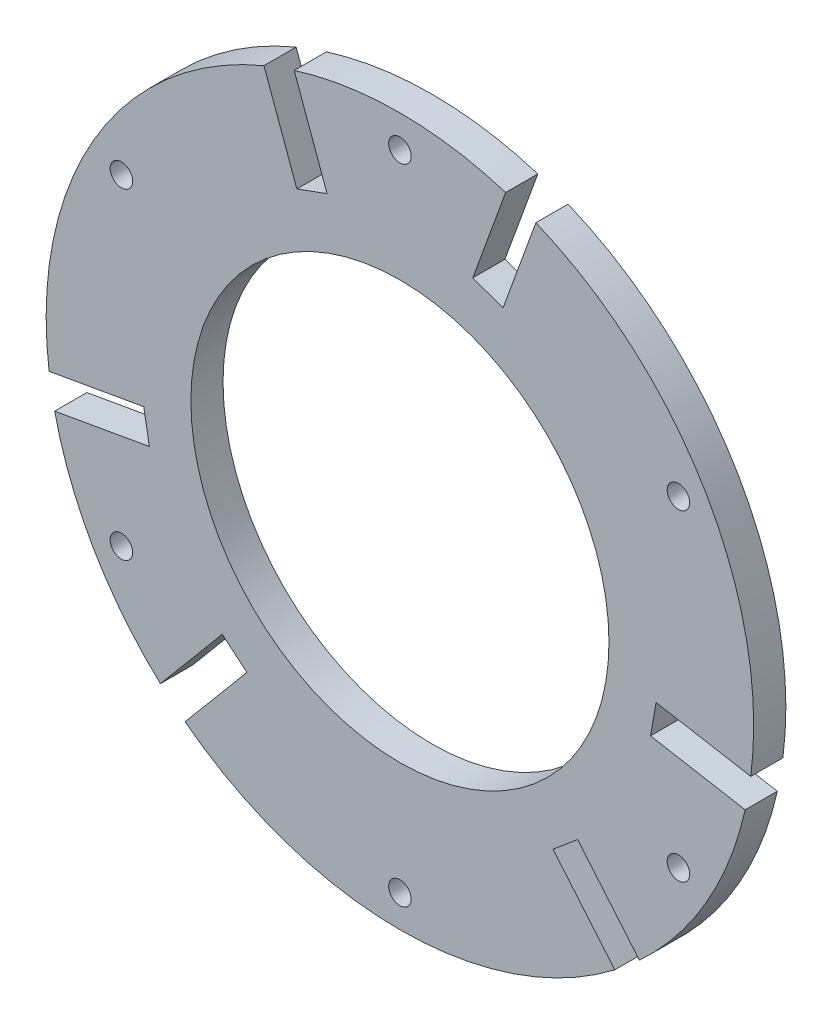
ISO-10303-21;
HEADER;
FILE_DESCRIPTION(('STEP AP214'),'2;1');
FILE_NAME('part.step','',(''),(''),'','','');
FILE_SCHEMA(('AUTOMOTIVE_DESIGN { 1 0 10303 214 1 1 1 1 }'));
ENDSEC;
DATA;
#1=APPLICATION_CONTEXT('core data for automotive mechanical design processes');
#2=APPLICATION_PROTOCOL_DEFINITION('international standard','automotive_design',2000,#1);
#3=PRODUCT_CONTEXT('',#1,'mechanical');
#4=PRODUCT('Part','Part','',(#3));
#5=PRODUCT_RELATED_PRODUCT_CATEGORY('part','',(#4));
#6=PRODUCT_DEFINITION_FORMATION('','',#4);
#7=PRODUCT_DEFINITION_CONTEXT('part definition',#1,'design');
#8=PRODUCT_DEFINITION('design','',#6,#7);
#9=PRODUCT_DEFINITION_SHAPE('','',#8);
#10=(LENGTH_UNIT() NAMED_UNIT(*) SI_UNIT(.MILLI.,.METRE.));
#11=(NAMED_UNIT(*) PLANE_ANGLE_UNIT() SI_UNIT($,.RADIAN.));
#12=(NAMED_UNIT(*) SI_UNIT($,.STERADIAN.) SOLID_ANGLE_UNIT());
#13=UNCERTAINTY_MEASURE_WITH_UNIT(LENGTH_MEASURE(1.E-05),#10,'distance_accuracy_value','');
#14=(GEOMETRIC_REPRESENTATION_CONTEXT(3) GLOBAL_UNCERTAINTY_ASSIGNED_CONTEXT((#13)) GLOBAL_UNIT_ASSIGNED_CONTEXT((#10,
#11,#12)) REPRESENTATION_CONTEXT('',''));
#15=CARTESIAN_POINT('',(0.,0.,0.));
#16=DIRECTION('',(0.,0.,1.));
#17=DIRECTION('',(1.,0.,0.));
#18=AXIS2_PLACEMENT_3D('',#15,#16,#17);
#19=CARTESIAN_POINT('',(0.,0.,5.));
#20=DIRECTION('',(0.,0.,-1.));
#21=DIRECTION('',(-1.,0.,0.));
#22=AXIS2_PLACEMENT_3D('',#19,#20,#21);
#23=CYLINDRICAL_SURFACE('',#22,55.);
#24=CARTESIAN_POINT('',(0.,0.,5.));
#25=DIRECTION('',(0.,0.,1.));
#26=DIRECTION('',(1.,0.,0.));
#27=AXIS2_PLACEMENT_3D('',#24,#25,#26);
#28=CIRCLE('',#27,55.);
#29=CARTESIAN_POINT('',(-53.6739247990592,-12.004573989315,5.));
#30=VERTEX_POINT('',#29);
#31=CARTESIAN_POINT('',(-37.2332284358741,-40.4806954021545,5.));
#32=VERTEX_POINT('',#31);
#33=EDGE_CURVE('E368',#30,#32,#28,.T.);
#34=ORIENTED_EDGE('',*,*,#33,.F.);
#35=DIRECTION('',(0.,0.,-1.));
#36=VECTOR('',#35,1.);
#37=CARTESIAN_POINT('',(-53.6739247990592,-12.004573989315,5.));
#38=LINE('',#37,#36);
#39=CARTESIAN_POINT('',(-53.6739247990592,-12.004573989315,0.));
#40=VERTEX_POINT('',#39);
#41=EDGE_CURVE('E226',#30,#40,#38,.T.);
#42=ORIENTED_EDGE('',*,*,#41,.T.);
#43=CARTESIAN_POINT('',(0.,0.,0.));
#44=DIRECTION('',(0.,0.,1.));
#45=DIRECTION('',(1.,0.,0.));
#46=AXIS2_PLACEMENT_3D('',#43,#44,#45);
#47=CIRCLE('',#46,55.);
#48=CARTESIAN_POINT('',(-37.2332284358741,-40.4806954021545,0.));
#49=VERTEX_POINT('',#48);
#50=EDGE_CURVE('E372',#40,#49,#47,.T.);
#51=ORIENTED_EDGE('',*,*,#50,.T.);
#52=DIRECTION('',(0.,0.,-1.));
#53=VECTOR('',#52,1.);
#54=CARTESIAN_POINT('',(-37.2332284358741,-40.4806954021545,5.));
#55=LINE('',#54,#53);
#56=EDGE_CURVE('E248',#49,#32,#55,.F.);
#57=ORIENTED_EDGE('',*,*,#56,.T.);
#58=EDGE_LOOP('',(#34,#42,#51,#57));
#59=FACE_BOUND('',#58,.T.);
#60=ADVANCED_FACE('F32',(#59),#23,.T.);
#61=CARTESIAN_POINT('',(-21.1392160617393,50.7753241673069,0.));
#62=VERTEX_POINT('',#61);
#63=CARTESIAN_POINT('',(-54.542328645147,-7.0805639581026,0.));
#64=VERTEX_POINT('',#63);
#65=EDGE_CURVE('E370',#62,#64,#47,.T.);
#66=ORIENTED_EDGE('',*,*,#65,.T.);
#67=DIRECTION('',(0.,0.,-1.));
#68=VECTOR('',#67,1.);
#69=CARTESIAN_POINT('',(-54.542328645147,-7.0805639581026,5.));
#70=LINE('',#69,#68);
#71=CARTESIAN_POINT('',(-54.542328645147,-7.0805639581026,5.));
#72=VERTEX_POINT('',#71);
#73=EDGE_CURVE('E47',#64,#72,#70,.F.);
#74=ORIENTED_EDGE('',*,*,#73,.T.);
#75=CARTESIAN_POINT('',(-21.1392160617393,50.7753241673069,5.));
#76=VERTEX_POINT('',#75);
#77=EDGE_CURVE('E364',#76,#72,#28,.T.);
#78=ORIENTED_EDGE('',*,*,#77,.F.);
#79=DIRECTION('',(0.,0.,-1.));
#80=VECTOR('',#79,1.);
#81=CARTESIAN_POINT('',(-21.1392160617393,50.7753241673069,5.));
#82=LINE('',#81,#80);
#83=EDGE_CURVE('E355',#76,#62,#82,.T.);
#84=ORIENTED_EDGE('',*,*,#83,.T.);
#85=EDGE_LOOP('',(#66,#74,#78,#84));
#86=FACE_BOUND('',#85,.T.);
#87=ADVANCED_FACE('F447',(#86),#23,.T.);
#88=CARTESIAN_POINT('',(37.2332284358955,-40.4806954021348,5.));
#89=VERTEX_POINT('',#88);
#90=CARTESIAN_POINT('',(53.6739247990633,-12.0045739892965,5.));
#91=VERTEX_POINT('',#90);
#92=EDGE_CURVE('E396',#89,#91,#28,.T.);
#93=ORIENTED_EDGE('',*,*,#92,.F.);
#94=DIRECTION('',(0.,0.,-1.));
#95=VECTOR('',#94,1.);
#96=CARTESIAN_POINT('',(37.2332284358955,-40.4806954021348,5.));
#97=LINE('',#96,#95);
#98=CARTESIAN_POINT('',(37.2332284358955,-40.4806954021348,0.));
#99=VERTEX_POINT('',#98);
#100=EDGE_CURVE('E273',#89,#99,#97,.T.);
#101=ORIENTED_EDGE('',*,*,#100,.T.);
#102=CARTESIAN_POINT('',(53.6739247990633,-12.0045739892965,0.));
#103=VERTEX_POINT('',#102);
#104=EDGE_CURVE('E419',#99,#103,#47,.T.);
#105=ORIENTED_EDGE('',*,*,#104,.T.);
#106=DIRECTION('',(0.,0.,-1.));
#107=VECTOR('',#106,1.);
#108=CARTESIAN_POINT('',(53.6739247990633,-12.0045739892965,5.));
#109=LINE('',#108,#107);
#110=EDGE_CURVE('E304',#103,#91,#109,.F.);
#111=ORIENTED_EDGE('',*,*,#110,.T.);
#112=EDGE_LOOP('',(#93,#101,#105,#111));
#113=FACE_BOUND('',#112,.T.);
#114=ADVANCED_FACE('F451',(#113),#23,.T.);
#115=CARTESIAN_POINT('',(-33.4031125833977,-43.6947602092157,5.));
#116=VERTEX_POINT('',#115);
#117=CARTESIAN_POINT('',(33.4031125834208,-43.6947602091981,5.));
#118=VERTEX_POINT('',#117);
#119=EDGE_CURVE('E393',#116,#118,#28,.T.);
#120=ORIENTED_EDGE('',*,*,#119,.F.);
#121=DIRECTION('',(0.,0.,-1.));
#122=VECTOR('',#121,1.);
#123=CARTESIAN_POINT('',(-33.4031125833976,-43.6947602092157,5.));
#124=LINE('',#123,#122);
#125=CARTESIAN_POINT('',(-33.4031125833977,-43.6947602092157,0.));
#126=VERTEX_POINT('',#125);
#127=EDGE_CURVE('E244',#116,#126,#124,.T.);
#128=ORIENTED_EDGE('',*,*,#127,.T.);
#129=CARTESIAN_POINT('',(33.4031125834208,-43.6947602091981,0.));
#130=VERTEX_POINT('',#129);
#131=EDGE_CURVE('E385',#126,#130,#47,.T.);
#132=ORIENTED_EDGE('',*,*,#131,.T.);
#133=DIRECTION('',(0.,0.,-1.));
#134=VECTOR('',#133,1.);
#135=CARTESIAN_POINT('',(33.4031125834208,-43.6947602091981,5.));
#136=LINE('',#135,#134);
#137=EDGE_CURVE('E269',#130,#118,#136,.F.);
#138=ORIENTED_EDGE('',*,*,#137,.T.);
#139=EDGE_LOOP('',(#120,#128,#132,#138));
#140=FACE_BOUND('',#139,.T.);
#141=ADVANCED_FACE('F391',(#140),#23,.T.);
#142=CARTESIAN_POINT('',(54.5423286451494,-7.08056395808375,5.));
#143=VERTEX_POINT('',#142);
#144=CARTESIAN_POINT('',(21.1392160617393,50.7753241673069,5.));
#145=VERTEX_POINT('',#144);
#146=EDGE_CURVE('E397',#143,#145,#28,.T.);
#147=ORIENTED_EDGE('',*,*,#146,.F.);
#148=DIRECTION('',(0.,0.,-1.));
#149=VECTOR('',#148,1.);
#150=CARTESIAN_POINT('',(54.5423286451494,-7.08056395808375,5.));
#151=LINE('',#150,#149);
#152=CARTESIAN_POINT('',(54.5423286451494,-7.08056395808375,0.));
#153=VERTEX_POINT('',#152);
#154=EDGE_CURVE('E299',#143,#153,#151,.T.);
#155=ORIENTED_EDGE('',*,*,#154,.T.);
#156=CARTESIAN_POINT('',(21.1392160617393,50.7753241673069,0.));
#157=VERTEX_POINT('',#156);
#158=EDGE_CURVE('E418',#153,#157,#47,.T.);
#159=ORIENTED_EDGE('',*,*,#158,.T.);
#160=DIRECTION('',(0.,0.,-1.));
#161=VECTOR('',#160,1.);
#162=CARTESIAN_POINT('',(21.1392160617393,50.7753241673069,5.));
#163=LINE('',#162,#161);
#164=EDGE_CURVE('E335',#157,#145,#163,.F.);
#165=ORIENTED_EDGE('',*,*,#164,.T.);
#166=EDGE_LOOP('',(#147,#155,#159,#165));
#167=FACE_BOUND('',#166,.T.);
#168=ADVANCED_FACE('F454',(#167),#23,.T.);
#169=CARTESIAN_POINT('',(16.4406963631761,52.4852693914573,5.));
#170=VERTEX_POINT('',#169);
#171=CARTESIAN_POINT('',(-16.4406963631761,52.4852693914573,5.));
#172=VERTEX_POINT('',#171);
#173=EDGE_CURVE('E369',#170,#172,#28,.T.);
#174=ORIENTED_EDGE('',*,*,#173,.F.);
#175=DIRECTION('',(0.,0.,-1.));
#176=VECTOR('',#175,1.);
#177=CARTESIAN_POINT('',(16.4406963631761,52.4852693914573,5.));
#178=LINE('',#177,#176);
#179=CARTESIAN_POINT('',(16.4406963631761,52.4852693914573,0.));
#180=VERTEX_POINT('',#179);
#181=EDGE_CURVE('E330',#170,#180,#178,.T.);
#182=ORIENTED_EDGE('',*,*,#181,.T.);
#183=CARTESIAN_POINT('',(-16.4406963631761,52.4852693914573,0.));
#184=VERTEX_POINT('',#183);
#185=EDGE_CURVE('E363',#180,#184,#47,.T.);
#186=ORIENTED_EDGE('',*,*,#185,.T.);
#187=DIRECTION('',(0.,0.,-1.));
#188=VECTOR('',#187,1.);
#189=CARTESIAN_POINT('',(-16.4406963631761,52.4852693914573,5.));
#190=LINE('',#189,#188);
#191=EDGE_CURVE('E360',#184,#172,#190,.F.);
#192=ORIENTED_EDGE('',*,*,#191,.T.);
#193=EDGE_LOOP('',(#174,#182,#186,#192));
#194=FACE_BOUND('',#193,.T.);
#195=ADVANCED_FACE('F34',(#194),#23,.T.);
#196=CARTESIAN_POINT('',(0.,0.,5.));
#197=DIRECTION('',(0.,0.,1.));
#198=DIRECTION('',(1.,0.,0.));
#199=AXIS2_PLACEMENT_3D('',#196,#197,#198);
#200=PLANE('',#199);
#201=CARTESIAN_POINT('',(-43.3012701892209,24.9999999999981,5.));
#202=DIRECTION('',(0.,0.,1.));
#203=DIRECTION('',(1.,0.,0.));
#204=AXIS2_PLACEMENT_3D('',#201,#202,#203);
#205=CIRCLE('',#204,1.75);
#206=CARTESIAN_POINT('',(-41.5512701892209,24.9999999999981,5.));
#207=VERTEX_POINT('',#206);
#208=EDGE_CURVE('E589',#207,#207,#205,.T.);
#209=ORIENTED_EDGE('',*,*,#208,.F.);
#210=EDGE_LOOP('',(#209));
#211=FACE_BOUND('',#210,.T.);
#212=CARTESIAN_POINT('',(-43.3012701892187,-25.0000000000019,5.));
#213=DIRECTION('',(0.,0.,1.));
#214=DIRECTION('',(1.,0.,0.));
#215=AXIS2_PLACEMENT_3D('',#212,#213,#214);
#216=CIRCLE('',#215,1.75);
#217=CARTESIAN_POINT('',(-41.5512701892187,-25.0000000000019,5.));
#218=VERTEX_POINT('',#217);
#219=EDGE_CURVE('E591',#218,#218,#216,.T.);
#220=ORIENTED_EDGE('',*,*,#219,.F.);
#221=EDGE_LOOP('',(#220));
#222=FACE_BOUND('',#221,.T.);
#223=CARTESIAN_POINT('',(4.251010553249E-12,-50.,5.));
#224=DIRECTION('',(0.,0.,1.));
#225=DIRECTION('',(1.,0.,0.));
#226=AXIS2_PLACEMENT_3D('',#223,#224,#225);
#227=CIRCLE('',#226,1.75);
#228=CARTESIAN_POINT('',(1.75000000000425,-50.,5.));
#229=VERTEX_POINT('',#228);
#230=EDGE_CURVE('E595',#229,#229,#227,.T.);
#231=ORIENTED_EDGE('',*,*,#230,.F.);
#232=EDGE_LOOP('',(#231));
#233=FACE_BOUND('',#232,.T.);
#234=CARTESIAN_POINT('',(43.3012701892251,-24.9999999999982,5.));
#235=DIRECTION('',(0.,0.,1.));
#236=DIRECTION('',(1.,0.,0.));
#237=AXIS2_PLACEMENT_3D('',#234,#235,#236);
#238=CIRCLE('',#237,1.75);
#239=CARTESIAN_POINT('',(45.0512701892251,-24.9999999999982,5.));
#240=VERTEX_POINT('',#239);
#241=EDGE_CURVE('E599',#240,#240,#238,.T.);
#242=ORIENTED_EDGE('',*,*,#241,.F.);
#243=EDGE_LOOP('',(#242));
#244=FACE_BOUND('',#243,.T.);
#245=CARTESIAN_POINT('',(43.301270189223,25.0000000000018,5.));
#246=DIRECTION('',(0.,0.,1.));
#247=DIRECTION('',(1.,0.,0.));
#248=AXIS2_PLACEMENT_3D('',#245,#246,#247);
#249=CIRCLE('',#248,1.75);
#250=CARTESIAN_POINT('',(45.051270189223,25.0000000000018,5.));
#251=VERTEX_POINT('',#250);
#252=EDGE_CURVE('E218',#251,#251,#249,.T.);
#253=ORIENTED_EDGE('',*,*,#252,.F.);
#254=EDGE_LOOP('',(#253));
#255=FACE_BOUND('',#254,.T.);
#256=DIRECTION('',(0.984807753012207,0.173648177666937,0.));
#257=VECTOR('',#256,1.);
#258=CARTESIAN_POINT('',(-38.9578739306604,-9.40973717173799,5.));
#259=LINE('',#258,#257);
#260=CARTESIAN_POINT('',(-38.9578739306604,-9.40973717173799,5.));
#261=VERTEX_POINT('',#260);
#262=EDGE_CURVE('E213',#30,#261,#259,.T.);
#263=ORIENTED_EDGE('',*,*,#262,.F.);
#264=ORIENTED_EDGE('',*,*,#33,.T.);
#265=DIRECTION('',(-0.642787609686544,-0.766044443118974,0.));
#266=VECTOR('',#265,1.);
#267=CARTESIAN_POINT('',(-27.6280083989812,-29.0336399155296,5.));
#268=LINE('',#267,#266);
#269=CARTESIAN_POINT('',(-27.6280083989812,-29.0336399155296,5.));
#270=VERTEX_POINT('',#269);
#271=EDGE_CURVE('E232',#270,#32,#268,.T.);
#272=ORIENTED_EDGE('',*,*,#271,.F.);
#273=DIRECTION('',(-0.766044443118974,0.642787609686544,0.));
#274=VECTOR('',#273,1.);
#275=CARTESIAN_POINT('',(-23.7977861833863,-32.2475779639624,5.));
#276=LINE('',#275,#274);
#277=CARTESIAN_POINT('',(-23.7977861833863,-32.2475779639624,5.));
#278=VERTEX_POINT('',#277);
#279=EDGE_CURVE('E237',#278,#270,#276,.T.);
#280=ORIENTED_EDGE('',*,*,#279,.F.);
#281=DIRECTION('',(0.642787609686544,0.766044443118974,0.));
#282=VECTOR('',#281,1.);
#283=CARTESIAN_POINT('',(-33.4396003286845,-43.738244610747,5.));
#284=LINE('',#283,#282);
#285=EDGE_CURVE('E229',#116,#278,#284,.T.);
#286=ORIENTED_EDGE('',*,*,#285,.F.);
#287=ORIENTED_EDGE('',*,*,#119,.T.);
#288=DIRECTION('',(0.642787609686545,-0.766044443118973,0.));
#289=VECTOR('',#288,1.);
#290=CARTESIAN_POINT('',(33.43960032871,-43.7382446107322,5.));
#291=LINE('',#290,#289);
#292=CARTESIAN_POINT('',(23.7977861834119,-32.2475779639476,5.));
#293=VERTEX_POINT('',#292);
#294=EDGE_CURVE('E262',#293,#118,#291,.T.);
#295=ORIENTED_EDGE('',*,*,#294,.F.);
#296=DIRECTION('',(-0.766044443118973,-0.642787609686545,0.));
#297=VECTOR('',#296,1.);
#298=CARTESIAN_POINT('',(23.7977861834119,-32.2475779639476,5.));
#299=LINE('',#298,#297);
#300=CARTESIAN_POINT('',(27.6280083990068,-29.0336399155149,5.));
#301=VERTEX_POINT('',#300);
#302=EDGE_CURVE('E251',#301,#293,#299,.T.);
#303=ORIENTED_EDGE('',*,*,#302,.F.);
#304=DIRECTION('',(-0.642787609686544,0.766044443118974,0.));
#305=VECTOR('',#304,1.);
#306=CARTESIAN_POINT('',(27.6280083990068,-29.0336399155149,5.));
#307=LINE('',#306,#305);
#308=EDGE_CURVE('E256',#89,#301,#307,.T.);
#309=ORIENTED_EDGE('',*,*,#308,.F.);
#310=ORIENTED_EDGE('',*,*,#92,.T.);
#311=DIRECTION('',(0.984807753012207,-0.173648177666936,0.));
#312=VECTOR('',#311,1.);
#313=CARTESIAN_POINT('',(38.9578739306859,-9.40973717172323,5.));
#314=LINE('',#313,#312);
#315=CARTESIAN_POINT('',(38.9578739306859,-9.40973717172323,5.));
#316=VERTEX_POINT('',#315);
#317=EDGE_CURVE('E287',#316,#91,#314,.T.);
#318=ORIENTED_EDGE('',*,*,#317,.F.);
#319=DIRECTION('',(-0.173648177666935,-0.984807753012207,0.));
#320=VECTOR('',#319,1.);
#321=CARTESIAN_POINT('',(39.8261148190206,-4.48569840666219,5.));
#322=LINE('',#321,#320);
#323=CARTESIAN_POINT('',(39.8261148190206,-4.48569840666219,5.));
#324=VERTEX_POINT('',#323);
#325=EDGE_CURVE('E292',#324,#316,#322,.T.);
#326=ORIENTED_EDGE('',*,*,#325,.F.);
#327=DIRECTION('',(-0.984807753012207,0.173648177666937,0.));
#328=VECTOR('',#327,1.);
#329=CARTESIAN_POINT('',(54.5982311142037,-7.09042107166623,5.));
#330=LINE('',#329,#328);
#331=EDGE_CURVE('E280',#143,#324,#330,.T.);
#332=ORIENTED_EDGE('',*,*,#331,.F.);
#333=ORIENTED_EDGE('',*,*,#146,.T.);
#334=DIRECTION('',(0.342020143325662,0.939692620785911,0.));
#335=VECTOR('',#334,1.);
#336=CARTESIAN_POINT('',(21.1586307854936,50.828665682427,5.));
#337=LINE('',#336,#335);
#338=CARTESIAN_POINT('',(16.0283286356087,36.7332763706383,5.));
#339=VERTEX_POINT('',#338);
#340=EDGE_CURVE('E311',#339,#145,#337,.T.);
#341=ORIENTED_EDGE('',*,*,#340,.F.);
#342=DIRECTION('',(0.939692620785911,-0.342020143325661,0.));
#343=VECTOR('',#342,1.);
#344=CARTESIAN_POINT('',(16.0283286356087,36.7332763706383,5.));
#345=LINE('',#344,#343);
#346=CARTESIAN_POINT('',(11.3298655316792,38.4433770872666,5.));
#347=VERTEX_POINT('',#346);
#348=EDGE_CURVE('E318',#347,#339,#345,.T.);
#349=ORIENTED_EDGE('',*,*,#348,.F.);
#350=DIRECTION('',(-0.342020143325663,-0.939692620785911,0.));
#351=VECTOR('',#350,1.);
#352=CARTESIAN_POINT('',(11.3298655316792,38.4433770872666,5.));
#353=LINE('',#352,#351);
#354=EDGE_CURVE('E324',#170,#347,#353,.T.);
#355=ORIENTED_EDGE('',*,*,#354,.F.);
#356=ORIENTED_EDGE('',*,*,#173,.T.);
#357=DIRECTION('',(-0.342020143325663,0.939692620785911,0.));
#358=VECTOR('',#357,1.);
#359=CARTESIAN_POINT('',(-11.3298655316791,38.4433770872666,5.));
#360=LINE('',#359,#358);
#361=CARTESIAN_POINT('',(-11.3298655316791,38.4433770872666,5.));
#362=VERTEX_POINT('',#361);
#363=EDGE_CURVE('E343',#362,#172,#360,.T.);
#364=ORIENTED_EDGE('',*,*,#363,.F.);
#365=DIRECTION('',(0.93969262078591,0.342020143325663,0.));
#366=VECTOR('',#365,1.);
#367=CARTESIAN_POINT('',(-16.0283286356087,36.7332763706383,5.));
#368=LINE('',#367,#366);
#369=CARTESIAN_POINT('',(-16.0283286356087,36.7332763706383,5.));
#370=VERTEX_POINT('',#369);
#371=EDGE_CURVE('E348',#370,#362,#368,.T.);
#372=ORIENTED_EDGE('',*,*,#371,.F.);
#373=DIRECTION('',(0.342020143325663,-0.939692620785911,0.));
#374=VECTOR('',#373,1.);
#375=CARTESIAN_POINT('',(-21.1586307854936,50.828665682427,5.));
#376=LINE('',#375,#374);
#377=EDGE_CURVE('E338',#76,#370,#376,.T.);
#378=ORIENTED_EDGE('',*,*,#377,.F.);
#379=ORIENTED_EDGE('',*,*,#77,.T.);
#380=DIRECTION('',(-0.984807753012207,-0.173648177666938,0.));
#381=VECTOR('',#380,1.);
#382=CARTESIAN_POINT('',(-54.5982311141781,-7.09042107168101,5.));
#383=LINE('',#382,#381);
#384=CARTESIAN_POINT('',(-39.8261148189951,-4.48569840667695,5.));
#385=VERTEX_POINT('',#384);
#386=EDGE_CURVE('E215',#385,#72,#383,.T.);
#387=ORIENTED_EDGE('',*,*,#386,.F.);
#388=DIRECTION('',(-0.173648177666938,0.984807753012207,0.));
#389=VECTOR('',#388,1.);
#390=CARTESIAN_POINT('',(-39.8261148189951,-4.48569840667695,5.));
#391=LINE('',#390,#389);
#392=EDGE_CURVE('E201',#261,#385,#391,.T.);
#393=ORIENTED_EDGE('',*,*,#392,.F.);
#394=EDGE_LOOP('',(#263,#264,#272,#280,#286,#287,#295,#303,#309,#310,#318,#326,#332,#333,#341,
#349,#355,#356,#364,#372,#378,#379,#387,#393));
#395=FACE_BOUND('',#394,.T.);
#396=CARTESIAN_POINT('',(0.00159899207128547,0.000923178502788741,5.));
#397=DIRECTION('',(0.,0.,1.));
#398=DIRECTION('',(1.,0.,0.));
#399=AXIS2_PLACEMENT_3D('',#396,#397,#398);
#400=CIRCLE('',#399,32.5);
#401=CARTESIAN_POINT('',(32.5015989920713,0.000923178502788741,5.));
#402=VERTEX_POINT('',#401);
#403=EDGE_CURVE('E276',#402,#402,#400,.T.);
#404=ORIENTED_EDGE('',*,*,#403,.F.);
#405=EDGE_LOOP('',(#404));
#406=FACE_BOUND('',#405,.T.);
#407=CARTESIAN_POINT('',(0.,50.,5.));
#408=DIRECTION('',(0.,0.,1.));
#409=DIRECTION('',(1.,0.,0.));
#410=AXIS2_PLACEMENT_3D('',#407,#408,#409);
#411=CIRCLE('',#410,1.75);
#412=CARTESIAN_POINT('',(1.75,50.,5.));
#413=VERTEX_POINT('',#412);
#414=EDGE_CURVE('E307',#413,#413,#411,.T.);
#415=ORIENTED_EDGE('',*,*,#414,.F.);
#416=EDGE_LOOP('',(#415));
#417=FACE_BOUND('',#416,.T.);
#418=ADVANCED_FACE('F408',(#211,#222,#233,#244,#255,#395,#406,#417),#200,.T.);
#419=CARTESIAN_POINT('',(0.,0.,0.));
#420=DIRECTION('',(0.,0.,1.));
#421=DIRECTION('',(1.,0.,0.));
#422=AXIS2_PLACEMENT_3D('',#419,#420,#421);
#423=PLANE('',#422);
#424=CARTESIAN_POINT('',(-43.3012701892209,24.9999999999981,0.));
#425=DIRECTION('',(0.,0.,1.));
#426=DIRECTION('',(1.,0.,0.));
#427=AXIS2_PLACEMENT_3D('',#424,#425,#426);
#428=CIRCLE('',#427,1.75);
#429=CARTESIAN_POINT('',(-41.5512701892209,24.9999999999981,0.));
#430=VERTEX_POINT('',#429);
#431=EDGE_CURVE('E500',#430,#430,#428,.T.);
#432=ORIENTED_EDGE('',*,*,#431,.T.);
#433=EDGE_LOOP('',(#432));
#434=FACE_BOUND('',#433,.T.);
#435=CARTESIAN_POINT('',(-43.3012701892187,-25.0000000000019,0.));
#436=DIRECTION('',(0.,0.,1.));
#437=DIRECTION('',(1.,0.,0.));
#438=AXIS2_PLACEMENT_3D('',#435,#436,#437);
#439=CIRCLE('',#438,1.75);
#440=CARTESIAN_POINT('',(-41.5512701892187,-25.0000000000019,0.));
#441=VERTEX_POINT('',#440);
#442=EDGE_CURVE('E504',#441,#441,#439,.T.);
#443=ORIENTED_EDGE('',*,*,#442,.T.);
#444=EDGE_LOOP('',(#443));
#445=FACE_BOUND('',#444,.T.);
#446=CARTESIAN_POINT('',(4.251010553249E-12,-50.,0.));
#447=DIRECTION('',(0.,0.,1.));
#448=DIRECTION('',(1.,0.,0.));
#449=AXIS2_PLACEMENT_3D('',#446,#447,#448);
#450=CIRCLE('',#449,1.75);
#451=CARTESIAN_POINT('',(1.75000000000425,-50.,0.));
#452=VERTEX_POINT('',#451);
#453=EDGE_CURVE('E508',#452,#452,#450,.T.);
#454=ORIENTED_EDGE('',*,*,#453,.T.);
#455=EDGE_LOOP('',(#454));
#456=FACE_BOUND('',#455,.T.);
#457=CARTESIAN_POINT('',(43.3012701892251,-24.9999999999982,0.));
#458=DIRECTION('',(0.,0.,1.));
#459=DIRECTION('',(1.,0.,0.));
#460=AXIS2_PLACEMENT_3D('',#457,#458,#459);
#461=CIRCLE('',#460,1.75);
#462=CARTESIAN_POINT('',(45.0512701892251,-24.9999999999982,0.));
#463=VERTEX_POINT('',#462);
#464=EDGE_CURVE('E512',#463,#463,#461,.T.);
#465=ORIENTED_EDGE('',*,*,#464,.T.);
#466=EDGE_LOOP('',(#465));
#467=FACE_BOUND('',#466,.T.);
#468=CARTESIAN_POINT('',(43.301270189223,25.0000000000018,0.));
#469=DIRECTION('',(0.,0.,1.));
#470=DIRECTION('',(1.,0.,0.));
#471=AXIS2_PLACEMENT_3D('',#468,#469,#470);
#472=CIRCLE('',#471,1.75);
#473=CARTESIAN_POINT('',(45.051270189223,25.0000000000018,0.));
#474=VERTEX_POINT('',#473);
#475=EDGE_CURVE('E222',#474,#474,#472,.T.);
#476=ORIENTED_EDGE('',*,*,#475,.T.);
#477=EDGE_LOOP('',(#476));
#478=FACE_BOUND('',#477,.T.);
#479=CARTESIAN_POINT('',(0.00159899207128547,0.000923178502788741,0.));
#480=DIRECTION('',(0.,0.,1.));
#481=DIRECTION('',(1.,0.,0.));
#482=AXIS2_PLACEMENT_3D('',#479,#480,#481);
#483=CIRCLE('',#482,32.5);
#484=CARTESIAN_POINT('',(32.5015989920713,0.000923178502788741,0.));
#485=VERTEX_POINT('',#484);
#486=EDGE_CURVE('E277',#485,#485,#483,.T.);
#487=ORIENTED_EDGE('',*,*,#486,.T.);
#488=EDGE_LOOP('',(#487));
#489=FACE_BOUND('',#488,.T.);
#490=CARTESIAN_POINT('',(0.,50.,0.));
#491=DIRECTION('',(0.,0.,1.));
#492=DIRECTION('',(1.,0.,0.));
#493=AXIS2_PLACEMENT_3D('',#490,#491,#492);
#494=CIRCLE('',#493,1.75);
#495=CARTESIAN_POINT('',(1.75,50.,0.));
#496=VERTEX_POINT('',#495);
#497=EDGE_CURVE('E308',#496,#496,#494,.T.);
#498=ORIENTED_EDGE('',*,*,#497,.T.);
#499=EDGE_LOOP('',(#498));
#500=FACE_BOUND('',#499,.T.);
#501=ORIENTED_EDGE('',*,*,#50,.F.);
#502=DIRECTION('',(0.984807753012207,0.173648177666937,0.));
#503=VECTOR('',#502,1.);
#504=CARTESIAN_POINT('',(0.434436189811763,-2.46381006506334,0.));
#505=LINE('',#504,#503);
#506=CARTESIAN_POINT('',(-38.9578739306604,-9.40973717173799,0.));
#507=VERTEX_POINT('',#506);
#508=EDGE_CURVE('E11',#40,#507,#505,.T.);
#509=ORIENTED_EDGE('',*,*,#508,.T.);
#510=DIRECTION('',(-0.173648177666938,0.984807753012207,0.));
#511=VECTOR('',#510,1.);
#512=CARTESIAN_POINT('',(-39.8261148189951,-4.48569840667695,0.));
#513=LINE('',#512,#511);
#514=CARTESIAN_POINT('',(-39.8261148189951,-4.48569840667695,0.));
#515=VERTEX_POINT('',#514);
#516=EDGE_CURVE('E199',#507,#515,#513,.T.);
#517=ORIENTED_EDGE('',*,*,#516,.T.);
#518=DIRECTION('',(-0.984807753012207,-0.173648177666938,0.));
#519=VECTOR('',#518,1.);
#520=CARTESIAN_POINT('',(-54.5982311141781,-7.09042107168101,0.));
#521=LINE('',#520,#519);
#522=EDGE_CURVE('E204',#515,#64,#521,.T.);
#523=ORIENTED_EDGE('',*,*,#522,.T.);
#524=ORIENTED_EDGE('',*,*,#65,.F.);
#525=DIRECTION('',(0.342020143325663,-0.939692620785911,0.));
#526=VECTOR('',#525,1.);
#527=CARTESIAN_POINT('',(-2.34752290258221,-0.854428460798103,0.));
#528=LINE('',#527,#526);
#529=CARTESIAN_POINT('',(-16.0283286356087,36.7332763706383,0.));
#530=VERTEX_POINT('',#529);
#531=EDGE_CURVE('E367',#62,#530,#528,.T.);
#532=ORIENTED_EDGE('',*,*,#531,.T.);
#533=DIRECTION('',(0.93969262078591,0.342020143325663,0.));
#534=VECTOR('',#533,1.);
#535=CARTESIAN_POINT('',(-16.0283286356087,36.7332763706383,0.));
#536=LINE('',#535,#534);
#537=CARTESIAN_POINT('',(-11.3298655316791,38.4433770872666,0.));
#538=VERTEX_POINT('',#537);
#539=EDGE_CURVE('E339',#530,#538,#536,.T.);
#540=ORIENTED_EDGE('',*,*,#539,.T.);
#541=DIRECTION('',(-0.342020143325663,0.939692620785911,0.));
#542=VECTOR('',#541,1.);
#543=CARTESIAN_POINT('',(-11.3298655316791,38.4433770872666,0.));
#544=LINE('',#543,#542);
#545=EDGE_CURVE('E342',#538,#184,#544,.T.);
#546=ORIENTED_EDGE('',*,*,#545,.T.);
#547=ORIENTED_EDGE('',*,*,#185,.F.);
#548=DIRECTION('',(-0.342020143325663,-0.939692620785911,0.));
#549=VECTOR('',#548,1.);
#550=CARTESIAN_POINT('',(-2.35094020134736,0.855672255830215,0.));
#551=LINE('',#550,#549);
#552=CARTESIAN_POINT('',(11.3298655316791,38.4433770872666,0.));
#553=VERTEX_POINT('',#552);
#554=EDGE_CURVE('E375',#180,#553,#551,.T.);
#555=ORIENTED_EDGE('',*,*,#554,.T.);
#556=DIRECTION('',(0.939692620785911,-0.342020143325661,0.));
#557=VECTOR('',#556,1.);
#558=CARTESIAN_POINT('',(16.0283286356087,36.7332763706383,0.));
#559=LINE('',#558,#557);
#560=CARTESIAN_POINT('',(16.0283286356087,36.7332763706383,0.));
#561=VERTEX_POINT('',#560);
#562=EDGE_CURVE('E317',#553,#561,#559,.T.);
#563=ORIENTED_EDGE('',*,*,#562,.T.);
#564=DIRECTION('',(0.342020143325662,0.939692620785911,0.));
#565=VECTOR('',#564,1.);
#566=CARTESIAN_POINT('',(21.1586307854936,50.828665682427,0.));
#567=LINE('',#566,#565);
#568=EDGE_CURVE('E314',#561,#157,#567,.T.);
#569=ORIENTED_EDGE('',*,*,#568,.T.);
#570=ORIENTED_EDGE('',*,*,#158,.F.);
#571=DIRECTION('',(-0.984807753012207,0.173648177666937,0.));
#572=VECTOR('',#571,1.);
#573=CARTESIAN_POINT('',(0.433804698526212,2.46022870001636,0.));
#574=LINE('',#573,#572);
#575=CARTESIAN_POINT('',(39.8261148190206,-4.48569840666219,0.));
#576=VERTEX_POINT('',#575);
#577=EDGE_CURVE('E378',#153,#576,#574,.T.);
#578=ORIENTED_EDGE('',*,*,#577,.T.);
#579=DIRECTION('',(-0.173648177666935,-0.984807753012207,0.));
#580=VECTOR('',#579,1.);
#581=CARTESIAN_POINT('',(39.8261148190206,-4.48569840666219,0.));
#582=LINE('',#581,#580);
#583=CARTESIAN_POINT('',(38.9578739306859,-9.40973717172323,0.));
#584=VERTEX_POINT('',#583);
#585=EDGE_CURVE('E283',#576,#584,#582,.T.);
#586=ORIENTED_EDGE('',*,*,#585,.T.);
#587=DIRECTION('',(0.984807753012207,-0.173648177666936,0.));
#588=VECTOR('',#587,1.);
#589=CARTESIAN_POINT('',(38.9578739306859,-9.40973717172323,0.));
#590=LINE('',#589,#588);
#591=EDGE_CURVE('E286',#584,#103,#590,.T.);
#592=ORIENTED_EDGE('',*,*,#591,.T.);
#593=ORIENTED_EDGE('',*,*,#104,.F.);
#594=DIRECTION('',(-0.642787609686545,0.766044443118974,0.));
#595=VECTOR('',#594,1.);
#596=CARTESIAN_POINT('',(1.91650401154836,1.60813780924003,0.));
#597=LINE('',#596,#595);
#598=CARTESIAN_POINT('',(27.6280083990068,-29.0336399155149,0.));
#599=VERTEX_POINT('',#598);
#600=EDGE_CURVE('E381',#99,#599,#597,.T.);
#601=ORIENTED_EDGE('',*,*,#600,.T.);
#602=DIRECTION('',(-0.766044443118973,-0.642787609686545,0.));
#603=VECTOR('',#602,1.);
#604=CARTESIAN_POINT('',(23.7977861834119,-32.2475779639476,0.));
#605=LINE('',#604,#603);
#606=CARTESIAN_POINT('',(23.7977861834119,-32.2475779639476,0.));
#607=VERTEX_POINT('',#606);
#608=EDGE_CURVE('E252',#599,#607,#605,.T.);
#609=ORIENTED_EDGE('',*,*,#608,.T.);
#610=DIRECTION('',(0.642787609686545,-0.766044443118973,0.));
#611=VECTOR('',#610,1.);
#612=CARTESIAN_POINT('',(33.43960032871,-43.7382446107322,0.));
#613=LINE('',#612,#611);
#614=EDGE_CURVE('E255',#607,#130,#613,.T.);
#615=ORIENTED_EDGE('',*,*,#614,.T.);
#616=ORIENTED_EDGE('',*,*,#131,.F.);
#617=DIRECTION('',(0.642787609686544,0.766044443118974,0.));
#618=VECTOR('',#617,1.);
#619=CARTESIAN_POINT('',(1.91371820406876,-1.60580023921137,0.));
#620=LINE('',#619,#618);
#621=CARTESIAN_POINT('',(-23.7977861833863,-32.2475779639624,0.));
#622=VERTEX_POINT('',#621);
#623=EDGE_CURVE('E40',#126,#622,#620,.T.);
#624=ORIENTED_EDGE('',*,*,#623,.T.);
#625=DIRECTION('',(-0.766044443118974,0.642787609686544,0.));
#626=VECTOR('',#625,1.);
#627=CARTESIAN_POINT('',(-23.7977861833863,-32.2475779639624,0.));
#628=LINE('',#627,#626);
#629=CARTESIAN_POINT('',(-27.6280083989812,-29.0336399155296,0.));
#630=VERTEX_POINT('',#629);
#631=EDGE_CURVE('E55',#622,#630,#628,.T.);
#632=ORIENTED_EDGE('',*,*,#631,.T.);
#633=DIRECTION('',(-0.642787609686544,-0.766044443118974,0.));
#634=VECTOR('',#633,1.);
#635=CARTESIAN_POINT('',(-27.6280083989812,-29.0336399155296,0.));
#636=LINE('',#635,#634);
#637=EDGE_CURVE('E231',#630,#49,#636,.T.);
#638=ORIENTED_EDGE('',*,*,#637,.T.);
#639=EDGE_LOOP('',(#501,#509,#517,#523,#524,#532,#540,#546,#547,#555,#563,#569,#570,#578,#586,
#592,#593,#601,#609,#615,#616,#624,#632,#638));
#640=FACE_BOUND('',#639,.T.);
#641=ADVANCED_FACE('F212',(#434,#445,#456,#467,#478,#489,#500,#640),#423,.F.);
#642=CARTESIAN_POINT('',(-11.3298655316791,38.4433770872666,0.));
#643=DIRECTION('',(0.93969262078591,0.342020143325663,0.));
#644=DIRECTION('',(-0.342020143325663,0.939692620785911,0.));
#645=AXIS2_PLACEMENT_3D('',#642,#643,#644);
#646=PLANE('',#645);
#647=ORIENTED_EDGE('',*,*,#545,.F.);
#648=DIRECTION('',(0.,0.,1.));
#649=VECTOR('',#648,1.);
#650=CARTESIAN_POINT('',(-11.3298655316791,38.4433770872666,0.));
#651=LINE('',#650,#649);
#652=EDGE_CURVE('E353',#538,#362,#651,.T.);
#653=ORIENTED_EDGE('',*,*,#652,.T.);
#654=ORIENTED_EDGE('',*,*,#363,.T.);
#655=ORIENTED_EDGE('',*,*,#191,.F.);
#656=EDGE_LOOP('',(#647,#653,#654,#655));
#657=FACE_BOUND('',#656,.T.);
#658=ADVANCED_FACE('F416',(#657),#646,.F.);
#659=CARTESIAN_POINT('',(-21.1586307854936,50.828665682427,0.));
#660=DIRECTION('',(-0.939692620785911,-0.342020143325663,0.));
#661=DIRECTION('',(0.342020143325663,-0.939692620785911,0.));
#662=AXIS2_PLACEMENT_3D('',#659,#660,#661);
#663=PLANE('',#662);
#664=ORIENTED_EDGE('',*,*,#377,.T.);
#665=DIRECTION('',(0.,0.,1.));
#666=VECTOR('',#665,1.);
#667=CARTESIAN_POINT('',(-16.0283286356087,36.7332763706383,0.));
#668=LINE('',#667,#666);
#669=EDGE_CURVE('E346',#530,#370,#668,.T.);
#670=ORIENTED_EDGE('',*,*,#669,.F.);
#671=ORIENTED_EDGE('',*,*,#531,.F.);
#672=ORIENTED_EDGE('',*,*,#83,.F.);
#673=EDGE_LOOP('',(#664,#670,#671,#672));
#674=FACE_BOUND('',#673,.T.);
#675=ADVANCED_FACE('F486',(#674),#663,.F.);
#676=CARTESIAN_POINT('',(-16.0283286356087,36.7332763706383,0.));
#677=DIRECTION('',(0.342020143325663,-0.93969262078591,0.));
#678=DIRECTION('',(0.939692620785911,0.342020143325663,0.));
#679=AXIS2_PLACEMENT_3D('',#676,#677,#678);
#680=PLANE('',#679);
#681=ORIENTED_EDGE('',*,*,#371,.T.);
#682=ORIENTED_EDGE('',*,*,#652,.F.);
#683=ORIENTED_EDGE('',*,*,#539,.F.);
#684=ORIENTED_EDGE('',*,*,#669,.T.);
#685=EDGE_LOOP('',(#681,#682,#683,#684));
#686=FACE_BOUND('',#685,.T.);
#687=ADVANCED_FACE('F480',(#686),#680,.F.);
#688=CARTESIAN_POINT('',(21.1586307854936,50.828665682427,0.));
#689=DIRECTION('',(0.939692620785911,-0.342020143325662,0.));
#690=DIRECTION('',(0.342020143325662,0.939692620785911,0.));
#691=AXIS2_PLACEMENT_3D('',#688,#689,#690);
#692=PLANE('',#691);
#693=ORIENTED_EDGE('',*,*,#568,.F.);
#694=DIRECTION('',(0.,0.,1.));
#695=VECTOR('',#694,1.);
#696=CARTESIAN_POINT('',(16.0283286356087,36.7332763706383,0.));
#697=LINE('',#696,#695);
#698=EDGE_CURVE('E328',#561,#339,#697,.T.);
#699=ORIENTED_EDGE('',*,*,#698,.T.);
#700=ORIENTED_EDGE('',*,*,#340,.T.);
#701=ORIENTED_EDGE('',*,*,#164,.F.);
#702=EDGE_LOOP('',(#693,#699,#700,#701));
#703=FACE_BOUND('',#702,.T.);
#704=ADVANCED_FACE('F466',(#703),#692,.F.);
#705=CARTESIAN_POINT('',(11.3298655316792,38.4433770872666,0.));
#706=DIRECTION('',(-0.939692620785911,0.342020143325663,0.));
#707=DIRECTION('',(-0.342020143325663,-0.939692620785911,0.));
#708=AXIS2_PLACEMENT_3D('',#705,#706,#707);
#709=PLANE('',#708);
#710=ORIENTED_EDGE('',*,*,#354,.T.);
#711=DIRECTION('',(0.,0.,1.));
#712=VECTOR('',#711,1.);
#713=CARTESIAN_POINT('',(11.3298655316792,38.4433770872666,0.));
#714=LINE('',#713,#712);
#715=EDGE_CURVE('E321',#553,#347,#714,.T.);
#716=ORIENTED_EDGE('',*,*,#715,.F.);
#717=ORIENTED_EDGE('',*,*,#554,.F.);
#718=ORIENTED_EDGE('',*,*,#181,.F.);
#719=EDGE_LOOP('',(#710,#716,#717,#718));
#720=FACE_BOUND('',#719,.T.);
#721=ADVANCED_FACE('F471',(#720),#709,.F.);
#722=CARTESIAN_POINT('',(16.0283286356087,36.7332763706383,0.));
#723=DIRECTION('',(-0.342020143325661,-0.939692620785911,0.));
#724=DIRECTION('',(0.939692620785911,-0.342020143325661,0.));
#725=AXIS2_PLACEMENT_3D('',#722,#723,#724);
#726=PLANE('',#725);
#727=ORIENTED_EDGE('',*,*,#348,.T.);
#728=ORIENTED_EDGE('',*,*,#698,.F.);
#729=ORIENTED_EDGE('',*,*,#562,.F.);
#730=ORIENTED_EDGE('',*,*,#715,.T.);
#731=EDGE_LOOP('',(#727,#728,#729,#730));
#732=FACE_BOUND('',#731,.T.);
#733=ADVANCED_FACE('F469',(#732),#726,.F.);
#734=CARTESIAN_POINT('',(0.,50.,0.));
#735=DIRECTION('',(0.,0.,1.));
#736=DIRECTION('',(1.,0.,0.));
#737=AXIS2_PLACEMENT_3D('',#734,#735,#736);
#738=CYLINDRICAL_SURFACE('',#737,1.75);
#739=ORIENTED_EDGE('',*,*,#497,.F.);
#740=EDGE_LOOP('',(#739));
#741=FACE_BOUND('',#740,.T.);
#742=ORIENTED_EDGE('',*,*,#414,.T.);
#743=EDGE_LOOP('',(#742));
#744=FACE_BOUND('',#743,.T.);
#745=ADVANCED_FACE('F478',(#741,#744),#738,.F.);
#746=CARTESIAN_POINT('',(38.9578739306859,-9.40973717172323,0.));
#747=DIRECTION('',(-0.173648177666936,-0.984807753012207,0.));
#748=DIRECTION('',(0.984807753012207,-0.173648177666936,0.));
#749=AXIS2_PLACEMENT_3D('',#746,#747,#748);
#750=PLANE('',#749);
#751=ORIENTED_EDGE('',*,*,#591,.F.);
#752=DIRECTION('',(0.,0.,1.));
#753=VECTOR('',#752,1.);
#754=CARTESIAN_POINT('',(38.9578739306859,-9.40973717172323,0.));
#755=LINE('',#754,#753);
#756=EDGE_CURVE('E297',#584,#316,#755,.T.);
#757=ORIENTED_EDGE('',*,*,#756,.T.);
#758=ORIENTED_EDGE('',*,*,#317,.T.);
#759=ORIENTED_EDGE('',*,*,#110,.F.);
#760=EDGE_LOOP('',(#751,#757,#758,#759));
#761=FACE_BOUND('',#760,.T.);
#762=ADVANCED_FACE('F522',(#761),#750,.F.);
#763=CARTESIAN_POINT('',(54.5982311142037,-7.09042107166623,0.));
#764=DIRECTION('',(0.173648177666937,0.984807753012207,0.));
#765=DIRECTION('',(-0.984807753012207,0.173648177666937,0.));
#766=AXIS2_PLACEMENT_3D('',#763,#764,#765);
#767=PLANE('',#766);
#768=ORIENTED_EDGE('',*,*,#331,.T.);
#769=DIRECTION('',(0.,0.,1.));
#770=VECTOR('',#769,1.);
#771=CARTESIAN_POINT('',(39.8261148190206,-4.48569840666219,0.));
#772=LINE('',#771,#770);
#773=EDGE_CURVE('E290',#576,#324,#772,.T.);
#774=ORIENTED_EDGE('',*,*,#773,.F.);
#775=ORIENTED_EDGE('',*,*,#577,.F.);
#776=ORIENTED_EDGE('',*,*,#154,.F.);
#777=EDGE_LOOP('',(#768,#774,#775,#776));
#778=FACE_BOUND('',#777,.T.);
#779=ADVANCED_FACE('F528',(#778),#767,.F.);
#780=CARTESIAN_POINT('',(39.8261148190206,-4.48569840666219,0.));
#781=DIRECTION('',(-0.984807753012207,0.173648177666935,0.));
#782=DIRECTION('',(-0.173648177666935,-0.984807753012207,0.));
#783=AXIS2_PLACEMENT_3D('',#780,#781,#782);
#784=PLANE('',#783);
#785=ORIENTED_EDGE('',*,*,#325,.T.);
#786=ORIENTED_EDGE('',*,*,#756,.F.);
#787=ORIENTED_EDGE('',*,*,#585,.F.);
#788=ORIENTED_EDGE('',*,*,#773,.T.);
#789=EDGE_LOOP('',(#785,#786,#787,#788));
#790=FACE_BOUND('',#789,.T.);
#791=ADVANCED_FACE('F534',(#790),#784,.F.);
#792=CARTESIAN_POINT('',(0.00159899207128547,0.000923178502788741,0.));
#793=DIRECTION('',(0.,0.,1.));
#794=DIRECTION('',(1.,0.,0.));
#795=AXIS2_PLACEMENT_3D('',#792,#793,#794);
#796=CYLINDRICAL_SURFACE('',#795,32.5);
#797=ORIENTED_EDGE('',*,*,#486,.F.);
#798=EDGE_LOOP('',(#797));
#799=FACE_BOUND('',#798,.T.);
#800=ORIENTED_EDGE('',*,*,#403,.T.);
#801=EDGE_LOOP('',(#800));
#802=FACE_BOUND('',#801,.T.);
#803=ADVANCED_FACE('F537',(#799,#802),#796,.F.);
#804=CARTESIAN_POINT('',(27.6280083990068,-29.0336399155149,0.));
#805=DIRECTION('',(0.766044443118974,0.642787609686545,0.));
#806=DIRECTION('',(-0.642787609686545,0.766044443118974,0.));
#807=AXIS2_PLACEMENT_3D('',#804,#805,#806);
#808=PLANE('',#807);
#809=ORIENTED_EDGE('',*,*,#308,.T.);
#810=DIRECTION('',(0.,0.,1.));
#811=VECTOR('',#810,1.);
#812=CARTESIAN_POINT('',(27.6280083990068,-29.0336399155149,0.));
#813=LINE('',#812,#811);
#814=EDGE_CURVE('E266',#599,#301,#813,.T.);
#815=ORIENTED_EDGE('',*,*,#814,.F.);
#816=ORIENTED_EDGE('',*,*,#600,.F.);
#817=ORIENTED_EDGE('',*,*,#100,.F.);
#818=EDGE_LOOP('',(#809,#815,#816,#817));
#819=FACE_BOUND('',#818,.T.);
#820=ADVANCED_FACE('F542',(#819),#808,.F.);
#821=CARTESIAN_POINT('',(33.43960032871,-43.7382446107322,0.));
#822=DIRECTION('',(-0.766044443118973,-0.642787609686545,0.));
#823=DIRECTION('',(0.642787609686545,-0.766044443118973,0.));
#824=AXIS2_PLACEMENT_3D('',#821,#822,#823);
#825=PLANE('',#824);
#826=ORIENTED_EDGE('',*,*,#614,.F.);
#827=DIRECTION('',(0.,0.,1.));
#828=VECTOR('',#827,1.);
#829=CARTESIAN_POINT('',(23.7977861834119,-32.2475779639476,0.));
#830=LINE('',#829,#828);
#831=EDGE_CURVE('E259',#607,#293,#830,.T.);
#832=ORIENTED_EDGE('',*,*,#831,.T.);
#833=ORIENTED_EDGE('',*,*,#294,.T.);
#834=ORIENTED_EDGE('',*,*,#137,.F.);
#835=EDGE_LOOP('',(#826,#832,#833,#834));
#836=FACE_BOUND('',#835,.T.);
#837=ADVANCED_FACE('F547',(#836),#825,.F.);
#838=CARTESIAN_POINT('',(23.7977861834119,-32.2475779639476,0.));
#839=DIRECTION('',(-0.642787609686545,0.766044443118973,0.));
#840=DIRECTION('',(-0.766044443118973,-0.642787609686545,0.));
#841=AXIS2_PLACEMENT_3D('',#838,#839,#840);
#842=PLANE('',#841);
#843=ORIENTED_EDGE('',*,*,#302,.T.);
#844=ORIENTED_EDGE('',*,*,#831,.F.);
#845=ORIENTED_EDGE('',*,*,#608,.F.);
#846=ORIENTED_EDGE('',*,*,#814,.T.);
#847=EDGE_LOOP('',(#843,#844,#845,#846));
#848=FACE_BOUND('',#847,.T.);
#849=ADVANCED_FACE('F544',(#848),#842,.F.);
#850=CARTESIAN_POINT('',(-27.6280083989812,-29.0336399155296,0.));
#851=DIRECTION('',(-0.766044443118974,0.642787609686544,0.));
#852=DIRECTION('',(-0.642787609686544,-0.766044443118974,0.));
#853=AXIS2_PLACEMENT_3D('',#850,#851,#852);
#854=PLANE('',#853);
#855=ORIENTED_EDGE('',*,*,#637,.F.);
#856=DIRECTION('',(0.,0.,1.));
#857=VECTOR('',#856,1.);
#858=CARTESIAN_POINT('',(-27.6280083989812,-29.0336399155296,0.));
#859=LINE('',#858,#857);
#860=EDGE_CURVE('E242',#630,#270,#859,.T.);
#861=ORIENTED_EDGE('',*,*,#860,.T.);
#862=ORIENTED_EDGE('',*,*,#271,.T.);
#863=ORIENTED_EDGE('',*,*,#56,.F.);
#864=EDGE_LOOP('',(#855,#861,#862,#863));
#865=FACE_BOUND('',#864,.T.);
#866=ADVANCED_FACE('F431',(#865),#854,.F.);
#867=CARTESIAN_POINT('',(-33.4396003286845,-43.738244610747,0.));
#868=DIRECTION('',(0.766044443118974,-0.642787609686544,0.));
#869=DIRECTION('',(0.642787609686544,0.766044443118974,0.));
#870=AXIS2_PLACEMENT_3D('',#867,#868,#869);
#871=PLANE('',#870);
#872=ORIENTED_EDGE('',*,*,#285,.T.);
#873=DIRECTION('',(0.,0.,1.));
#874=VECTOR('',#873,1.);
#875=CARTESIAN_POINT('',(-23.7977861833863,-32.2475779639624,0.));
#876=LINE('',#875,#874);
#877=EDGE_CURVE('E235',#622,#278,#876,.T.);
#878=ORIENTED_EDGE('',*,*,#877,.F.);
#879=ORIENTED_EDGE('',*,*,#623,.F.);
#880=ORIENTED_EDGE('',*,*,#127,.F.);
#881=EDGE_LOOP('',(#872,#878,#879,#880));
#882=FACE_BOUND('',#881,.T.);
#883=ADVANCED_FACE('F387',(#882),#871,.F.);
#884=CARTESIAN_POINT('',(-23.7977861833863,-32.2475779639624,0.));
#885=DIRECTION('',(0.642787609686544,0.766044443118974,0.));
#886=DIRECTION('',(-0.766044443118974,0.642787609686544,0.));
#887=AXIS2_PLACEMENT_3D('',#884,#885,#886);
#888=PLANE('',#887);
#889=ORIENTED_EDGE('',*,*,#279,.T.);
#890=ORIENTED_EDGE('',*,*,#860,.F.);
#891=ORIENTED_EDGE('',*,*,#631,.F.);
#892=ORIENTED_EDGE('',*,*,#877,.T.);
#893=EDGE_LOOP('',(#889,#890,#891,#892));
#894=FACE_BOUND('',#893,.T.);
#895=ADVANCED_FACE('F437',(#894),#888,.F.);
#896=CARTESIAN_POINT('',(-38.9578739306604,-9.40973717173799,0.));
#897=DIRECTION('',(0.173648177666937,-0.984807753012207,0.));
#898=DIRECTION('',(0.984807753012207,0.173648177666937,0.));
#899=AXIS2_PLACEMENT_3D('',#896,#897,#898);
#900=PLANE('',#899);
#901=ORIENTED_EDGE('',*,*,#262,.T.);
#902=DIRECTION('',(0.,0.,1.));
#903=VECTOR('',#902,1.);
#904=CARTESIAN_POINT('',(-38.9578739306604,-9.40973717173799,0.));
#905=LINE('',#904,#903);
#906=EDGE_CURVE('E203',#507,#261,#905,.T.);
#907=ORIENTED_EDGE('',*,*,#906,.F.);
#908=ORIENTED_EDGE('',*,*,#508,.F.);
#909=ORIENTED_EDGE('',*,*,#41,.F.);
#910=EDGE_LOOP('',(#901,#907,#908,#909));
#911=FACE_BOUND('',#910,.T.);
#912=ADVANCED_FACE('F435',(#911),#900,.F.);
#913=CARTESIAN_POINT('',(-54.5982311141781,-7.09042107168101,0.));
#914=DIRECTION('',(-0.173648177666938,0.984807753012207,0.));
#915=DIRECTION('',(-0.984807753012207,-0.173648177666938,0.));
#916=AXIS2_PLACEMENT_3D('',#913,#914,#915);
#917=PLANE('',#916);
#918=ORIENTED_EDGE('',*,*,#522,.F.);
#919=DIRECTION('',(0.,0.,1.));
#920=VECTOR('',#919,1.);
#921=CARTESIAN_POINT('',(-39.8261148189951,-4.48569840667695,0.));
#922=LINE('',#921,#920);
#923=EDGE_CURVE('E195',#515,#385,#922,.T.);
#924=ORIENTED_EDGE('',*,*,#923,.T.);
#925=ORIENTED_EDGE('',*,*,#386,.T.);
#926=ORIENTED_EDGE('',*,*,#73,.F.);
#927=EDGE_LOOP('',(#918,#924,#925,#926));
#928=FACE_BOUND('',#927,.T.);
#929=ADVANCED_FACE('F206',(#928),#917,.F.);
#930=CARTESIAN_POINT('',(-39.8261148189951,-4.48569840667695,0.));
#931=DIRECTION('',(0.984807753012207,0.173648177666938,0.));
#932=DIRECTION('',(-0.173648177666938,0.984807753012207,0.));
#933=AXIS2_PLACEMENT_3D('',#930,#931,#932);
#934=PLANE('',#933);
#935=ORIENTED_EDGE('',*,*,#392,.T.);
#936=ORIENTED_EDGE('',*,*,#923,.F.);
#937=ORIENTED_EDGE('',*,*,#516,.F.);
#938=ORIENTED_EDGE('',*,*,#906,.T.);
#939=EDGE_LOOP('',(#935,#936,#937,#938));
#940=FACE_BOUND('',#939,.T.);
#941=ADVANCED_FACE('F196',(#940),#934,.F.);
#942=CARTESIAN_POINT('',(43.301270189223,25.0000000000018,0.));
#943=DIRECTION('',(0.,0.,1.));
#944=DIRECTION('',(1.,0.,0.));
#945=AXIS2_PLACEMENT_3D('',#942,#943,#944);
#946=CYLINDRICAL_SURFACE('',#945,1.75);
#947=ORIENTED_EDGE('',*,*,#475,.F.);
#948=EDGE_LOOP('',(#947));
#949=FACE_BOUND('',#948,.T.);
#950=ORIENTED_EDGE('',*,*,#252,.T.);
#951=EDGE_LOOP('',(#950));
#952=FACE_BOUND('',#951,.T.);
#953=ADVANCED_FACE('F560',(#949,#952),#946,.F.);
#954=CARTESIAN_POINT('',(43.3012701892251,-24.9999999999982,0.));
#955=DIRECTION('',(0.,0.,1.));
#956=DIRECTION('',(1.,0.,0.));
#957=AXIS2_PLACEMENT_3D('',#954,#955,#956);
#958=CYLINDRICAL_SURFACE('',#957,1.75);
#959=ORIENTED_EDGE('',*,*,#464,.F.);
#960=EDGE_LOOP('',(#959));
#961=FACE_BOUND('',#960,.T.);
#962=ORIENTED_EDGE('',*,*,#241,.T.);
#963=EDGE_LOOP('',(#962));
#964=FACE_BOUND('',#963,.T.);
#965=ADVANCED_FACE('F564',(#961,#964),#958,.F.);
#966=CARTESIAN_POINT('',(4.251010553249E-12,-50.,0.));
#967=DIRECTION('',(0.,0.,1.));
#968=DIRECTION('',(1.,0.,0.));
#969=AXIS2_PLACEMENT_3D('',#966,#967,#968);
#970=CYLINDRICAL_SURFACE('',#969,1.75);
#971=ORIENTED_EDGE('',*,*,#453,.F.);
#972=EDGE_LOOP('',(#971));
#973=FACE_BOUND('',#972,.T.);
#974=ORIENTED_EDGE('',*,*,#230,.T.);
#975=EDGE_LOOP('',(#974));
#976=FACE_BOUND('',#975,.T.);
#977=ADVANCED_FACE('F569',(#973,#976),#970,.F.);
#978=CARTESIAN_POINT('',(-43.3012701892187,-25.0000000000019,0.));
#979=DIRECTION('',(0.,0.,1.));
#980=DIRECTION('',(1.,0.,0.));
#981=AXIS2_PLACEMENT_3D('',#978,#979,#980);
#982=CYLINDRICAL_SURFACE('',#981,1.75);
#983=ORIENTED_EDGE('',*,*,#442,.F.);
#984=EDGE_LOOP('',(#983));
#985=FACE_BOUND('',#984,.T.);
#986=ORIENTED_EDGE('',*,*,#219,.T.);
#987=EDGE_LOOP('',(#986));
#988=FACE_BOUND('',#987,.T.);
#989=ADVANCED_FACE('F576',(#985,#988),#982,.F.);
#990=CARTESIAN_POINT('',(-43.3012701892209,24.9999999999981,0.));
#991=DIRECTION('',(0.,0.,1.));
#992=DIRECTION('',(1.,0.,0.));
#993=AXIS2_PLACEMENT_3D('',#990,#991,#992);
#994=CYLINDRICAL_SURFACE('',#993,1.75);
#995=ORIENTED_EDGE('',*,*,#431,.F.);
#996=EDGE_LOOP('',(#995));
#997=FACE_BOUND('',#996,.T.);
#998=ORIENTED_EDGE('',*,*,#208,.T.);
#999=EDGE_LOOP('',(#998));
#1000=FACE_BOUND('',#999,.T.);
#1001=ADVANCED_FACE('F580',(#997,#1000),#994,.F.);
#1002=CLOSED_SHELL('',(#60,#87,#114,#141,#168,#195,#418,#641,#658,#675,#687,#704,#721,#733,#745,
#762,#779,#791,#803,#820,#837,#849,#866,#883,#895,#912,#929,#941,#953,#965,#977,#989,#1001));
#1003=MANIFOLD_SOLID_BREP('B2',#1002);
#1004=ADVANCED_BREP_SHAPE_REPRESENTATION('',(#18,#1003),#14);
#1005=SHAPE_DEFINITION_REPRESENTATION(#9,#1004);
ENDSEC;
END-ISO-10303-21;
